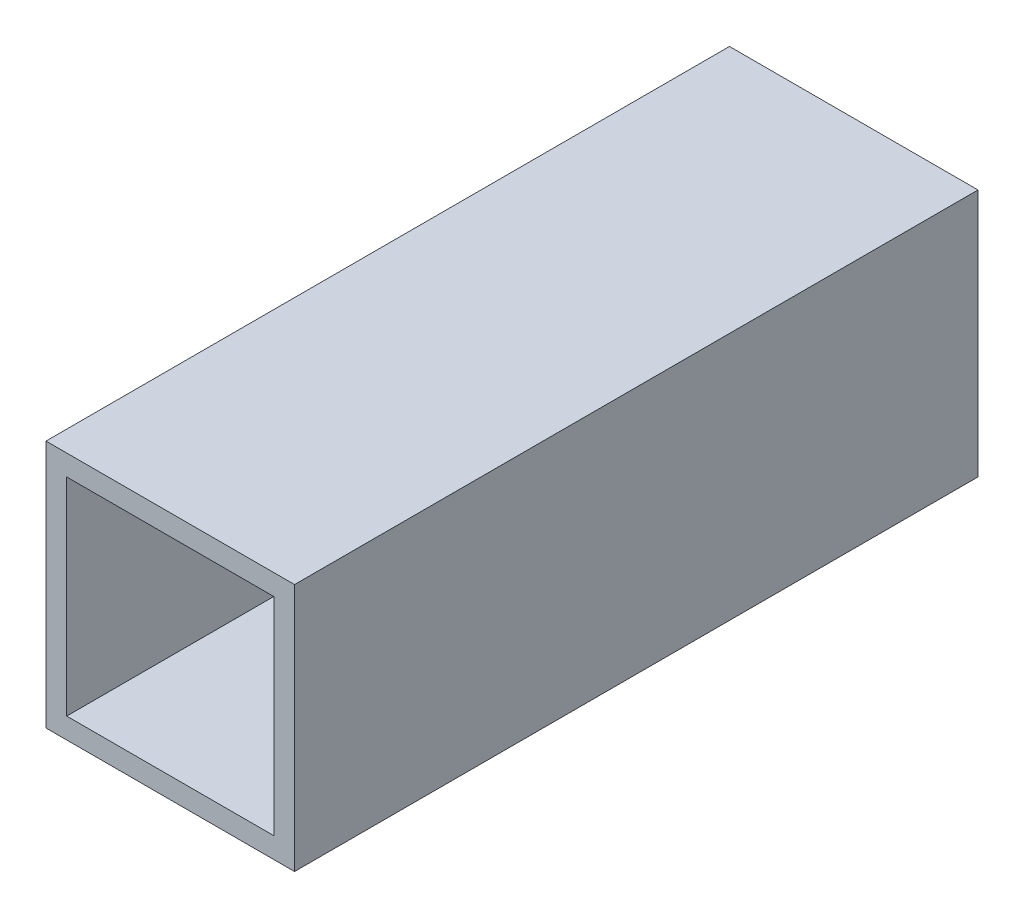
ISO-10303-21;
HEADER;
FILE_DESCRIPTION(('STEP AP214'),'2;1');
FILE_NAME('part.step','',(''),(''),'','','');
FILE_SCHEMA(('AUTOMOTIVE_DESIGN { 1 0 10303 214 1 1 1 1 }'));
ENDSEC;
DATA;
#1=APPLICATION_CONTEXT('core data for automotive mechanical design processes');
#2=APPLICATION_PROTOCOL_DEFINITION('international standard','automotive_design',2000,#1);
#3=PRODUCT_CONTEXT('',#1,'mechanical');
#4=PRODUCT('Part','Part','',(#3));
#5=PRODUCT_RELATED_PRODUCT_CATEGORY('part','',(#4));
#6=PRODUCT_DEFINITION_FORMATION('','',#4);
#7=PRODUCT_DEFINITION_CONTEXT('part definition',#1,'design');
#8=PRODUCT_DEFINITION('design','',#6,#7);
#9=PRODUCT_DEFINITION_SHAPE('','',#8);
#10=(LENGTH_UNIT() NAMED_UNIT(*) SI_UNIT(.MILLI.,.METRE.));
#11=(NAMED_UNIT(*) PLANE_ANGLE_UNIT() SI_UNIT($,.RADIAN.));
#12=(NAMED_UNIT(*) SI_UNIT($,.STERADIAN.) SOLID_ANGLE_UNIT());
#13=UNCERTAINTY_MEASURE_WITH_UNIT(LENGTH_MEASURE(1.E-05),#10,'distance_accuracy_value','');
#14=(GEOMETRIC_REPRESENTATION_CONTEXT(3) GLOBAL_UNCERTAINTY_ASSIGNED_CONTEXT((#13)) GLOBAL_UNIT_ASSIGNED_CONTEXT((#10,
#11,#12)) REPRESENTATION_CONTEXT('',''));
#15=CARTESIAN_POINT('',(0.,0.,0.));
#16=DIRECTION('',(0.,0.,1.));
#17=DIRECTION('',(1.,0.,0.));
#18=AXIS2_PLACEMENT_3D('',#15,#16,#17);
#19=CARTESIAN_POINT('',(0.,0.,33.));
#20=DIRECTION('',(0.,0.,1.));
#21=DIRECTION('',(1.,0.,0.));
#22=AXIS2_PLACEMENT_3D('',#19,#20,#21);
#23=PLANE('',#22);
#24=DIRECTION('',(0.,-1.,0.));
#25=VECTOR('',#24,1.);
#26=CARTESIAN_POINT('',(-12.,12.,33.));
#27=LINE('',#26,#25);
#28=CARTESIAN_POINT('',(-12.,12.,33.));
#29=VERTEX_POINT('',#28);
#30=CARTESIAN_POINT('',(-12.,-12.,33.));
#31=VERTEX_POINT('',#30);
#32=EDGE_CURVE('E138',#29,#31,#27,.T.);
#33=ORIENTED_EDGE('',*,*,#32,.T.);
#34=DIRECTION('',(1.,0.,0.));
#35=VECTOR('',#34,1.);
#36=CARTESIAN_POINT('',(-12.,-12.,33.));
#37=LINE('',#36,#35);
#38=CARTESIAN_POINT('',(12.,-12.,33.));
#39=VERTEX_POINT('',#38);
#40=EDGE_CURVE('E141',#31,#39,#37,.T.);
#41=ORIENTED_EDGE('',*,*,#40,.T.);
#42=DIRECTION('',(0.,1.,0.));
#43=VECTOR('',#42,1.);
#44=CARTESIAN_POINT('',(12.,12.,33.));
#45=LINE('',#44,#43);
#46=CARTESIAN_POINT('',(12.,12.,33.));
#47=VERTEX_POINT('',#46);
#48=EDGE_CURVE('E144',#39,#47,#45,.T.);
#49=ORIENTED_EDGE('',*,*,#48,.T.);
#50=DIRECTION('',(-1.,0.,0.));
#51=VECTOR('',#50,1.);
#52=CARTESIAN_POINT('',(-12.,12.,33.));
#53=LINE('',#52,#51);
#54=EDGE_CURVE('E146',#47,#29,#53,.T.);
#55=ORIENTED_EDGE('',*,*,#54,.T.);
#56=EDGE_LOOP('',(#33,#41,#49,#55));
#57=FACE_BOUND('',#56,.T.);
#58=DIRECTION('',(-1.,0.,0.));
#59=VECTOR('',#58,1.);
#60=CARTESIAN_POINT('',(-10.,10.,33.));
#61=LINE('',#60,#59);
#62=CARTESIAN_POINT('',(10.,10.,33.));
#63=VERTEX_POINT('',#62);
#64=CARTESIAN_POINT('',(-10.,10.,33.));
#65=VERTEX_POINT('',#64);
#66=EDGE_CURVE('E110',#63,#65,#61,.T.);
#67=ORIENTED_EDGE('',*,*,#66,.F.);
#68=DIRECTION('',(0.,1.,0.));
#69=VECTOR('',#68,1.);
#70=CARTESIAN_POINT('',(10.,10.,33.));
#71=LINE('',#70,#69);
#72=CARTESIAN_POINT('',(10.,-10.,33.));
#73=VERTEX_POINT('',#72);
#74=EDGE_CURVE('E102',#73,#63,#71,.T.);
#75=ORIENTED_EDGE('',*,*,#74,.F.);
#76=DIRECTION('',(1.,0.,0.));
#77=VECTOR('',#76,1.);
#78=CARTESIAN_POINT('',(-10.,-10.,33.));
#79=LINE('',#78,#77);
#80=CARTESIAN_POINT('',(-10.,-10.,33.));
#81=VERTEX_POINT('',#80);
#82=EDGE_CURVE('E124',#81,#73,#79,.T.);
#83=ORIENTED_EDGE('',*,*,#82,.F.);
#84=DIRECTION('',(0.,-1.,0.));
#85=VECTOR('',#84,1.);
#86=CARTESIAN_POINT('',(-10.,10.,33.));
#87=LINE('',#86,#85);
#88=EDGE_CURVE('E122',#65,#81,#87,.T.);
#89=ORIENTED_EDGE('',*,*,#88,.F.);
#90=EDGE_LOOP('',(#67,#75,#83,#89));
#91=FACE_BOUND('',#90,.T.);
#92=ADVANCED_FACE('F37',(#57,#91),#23,.T.);
#93=CARTESIAN_POINT('',(0.,0.,-33.));
#94=DIRECTION('',(0.,0.,1.));
#95=DIRECTION('',(1.,0.,0.));
#96=AXIS2_PLACEMENT_3D('',#93,#94,#95);
#97=PLANE('',#96);
#98=DIRECTION('',(0.,-1.,0.));
#99=VECTOR('',#98,1.);
#100=CARTESIAN_POINT('',(-12.,12.,-33.));
#101=LINE('',#100,#99);
#102=CARTESIAN_POINT('',(-12.,12.,-33.));
#103=VERTEX_POINT('',#102);
#104=CARTESIAN_POINT('',(-12.,-12.,-33.));
#105=VERTEX_POINT('',#104);
#106=EDGE_CURVE('E118',#103,#105,#101,.T.);
#107=ORIENTED_EDGE('',*,*,#106,.F.);
#108=DIRECTION('',(-1.,0.,0.));
#109=VECTOR('',#108,1.);
#110=CARTESIAN_POINT('',(-12.,12.,-33.));
#111=LINE('',#110,#109);
#112=CARTESIAN_POINT('',(12.,12.,-33.));
#113=VERTEX_POINT('',#112);
#114=EDGE_CURVE('E142',#113,#103,#111,.T.);
#115=ORIENTED_EDGE('',*,*,#114,.F.);
#116=DIRECTION('',(0.,1.,0.));
#117=VECTOR('',#116,1.);
#118=CARTESIAN_POINT('',(12.,12.,-33.));
#119=LINE('',#118,#117);
#120=CARTESIAN_POINT('',(12.,-12.,-33.));
#121=VERTEX_POINT('',#120);
#122=EDGE_CURVE('E153',#121,#113,#119,.T.);
#123=ORIENTED_EDGE('',*,*,#122,.F.);
#124=DIRECTION('',(1.,0.,0.));
#125=VECTOR('',#124,1.);
#126=CARTESIAN_POINT('',(-12.,-12.,-33.));
#127=LINE('',#126,#125);
#128=EDGE_CURVE('E151',#105,#121,#127,.T.);
#129=ORIENTED_EDGE('',*,*,#128,.F.);
#130=EDGE_LOOP('',(#107,#115,#123,#129));
#131=FACE_BOUND('',#130,.T.);
#132=DIRECTION('',(0.,1.,0.));
#133=VECTOR('',#132,1.);
#134=CARTESIAN_POINT('',(10.,10.,-33.));
#135=LINE('',#134,#133);
#136=CARTESIAN_POINT('',(10.,-10.,-33.));
#137=VERTEX_POINT('',#136);
#138=CARTESIAN_POINT('',(10.,10.,-33.));
#139=VERTEX_POINT('',#138);
#140=EDGE_CURVE('E60',#137,#139,#135,.T.);
#141=ORIENTED_EDGE('',*,*,#140,.T.);
#142=DIRECTION('',(-1.,0.,0.));
#143=VECTOR('',#142,1.);
#144=CARTESIAN_POINT('',(-10.,10.,-33.));
#145=LINE('',#144,#143);
#146=CARTESIAN_POINT('',(-10.,10.,-33.));
#147=VERTEX_POINT('',#146);
#148=EDGE_CURVE('E117',#139,#147,#145,.T.);
#149=ORIENTED_EDGE('',*,*,#148,.T.);
#150=DIRECTION('',(0.,-1.,0.));
#151=VECTOR('',#150,1.);
#152=CARTESIAN_POINT('',(-10.,10.,-33.));
#153=LINE('',#152,#151);
#154=CARTESIAN_POINT('',(-10.,-10.,-33.));
#155=VERTEX_POINT('',#154);
#156=EDGE_CURVE('E130',#147,#155,#153,.T.);
#157=ORIENTED_EDGE('',*,*,#156,.T.);
#158=DIRECTION('',(1.,0.,0.));
#159=VECTOR('',#158,1.);
#160=CARTESIAN_POINT('',(-10.,-10.,-33.));
#161=LINE('',#160,#159);
#162=EDGE_CURVE('E111',#155,#137,#161,.T.);
#163=ORIENTED_EDGE('',*,*,#162,.T.);
#164=EDGE_LOOP('',(#141,#149,#157,#163));
#165=FACE_BOUND('',#164,.T.);
#166=ADVANCED_FACE('F171',(#131,#165),#97,.F.);
#167=CARTESIAN_POINT('',(-12.,12.,33.));
#168=DIRECTION('',(1.,0.,0.));
#169=DIRECTION('',(0.,1.,0.));
#170=AXIS2_PLACEMENT_3D('',#167,#168,#169);
#171=PLANE('',#170);
#172=ORIENTED_EDGE('',*,*,#106,.T.);
#173=DIRECTION('',(0.,0.,-1.));
#174=VECTOR('',#173,1.);
#175=CARTESIAN_POINT('',(-12.,-12.,33.));
#176=LINE('',#175,#174);
#177=EDGE_CURVE('E11',#31,#105,#176,.T.);
#178=ORIENTED_EDGE('',*,*,#177,.F.);
#179=ORIENTED_EDGE('',*,*,#32,.F.);
#180=DIRECTION('',(0.,0.,-1.));
#181=VECTOR('',#180,1.);
#182=CARTESIAN_POINT('',(-12.,12.,33.));
#183=LINE('',#182,#181);
#184=EDGE_CURVE('E148',#29,#103,#183,.T.);
#185=ORIENTED_EDGE('',*,*,#184,.T.);
#186=EDGE_LOOP('',(#172,#178,#179,#185));
#187=FACE_BOUND('',#186,.T.);
#188=ADVANCED_FACE('F39',(#187),#171,.F.);
#189=CARTESIAN_POINT('',(-12.,-12.,33.));
#190=DIRECTION('',(0.,1.,0.));
#191=DIRECTION('',(-1.,0.,0.));
#192=AXIS2_PLACEMENT_3D('',#189,#190,#191);
#193=PLANE('',#192);
#194=ORIENTED_EDGE('',*,*,#128,.T.);
#195=DIRECTION('',(0.,0.,-1.));
#196=VECTOR('',#195,1.);
#197=CARTESIAN_POINT('',(12.,-12.,33.));
#198=LINE('',#197,#196);
#199=EDGE_CURVE('E45',#39,#121,#198,.T.);
#200=ORIENTED_EDGE('',*,*,#199,.F.);
#201=ORIENTED_EDGE('',*,*,#40,.F.);
#202=ORIENTED_EDGE('',*,*,#177,.T.);
#203=EDGE_LOOP('',(#194,#200,#201,#202));
#204=FACE_BOUND('',#203,.T.);
#205=ADVANCED_FACE('F181',(#204),#193,.F.);
#206=CARTESIAN_POINT('',(12.,12.,33.));
#207=DIRECTION('',(-1.,0.,0.));
#208=DIRECTION('',(0.,-1.,0.));
#209=AXIS2_PLACEMENT_3D('',#206,#207,#208);
#210=PLANE('',#209);
#211=ORIENTED_EDGE('',*,*,#122,.T.);
#212=DIRECTION('',(0.,0.,-1.));
#213=VECTOR('',#212,1.);
#214=CARTESIAN_POINT('',(12.,12.,33.));
#215=LINE('',#214,#213);
#216=EDGE_CURVE('E158',#47,#113,#215,.T.);
#217=ORIENTED_EDGE('',*,*,#216,.F.);
#218=ORIENTED_EDGE('',*,*,#48,.F.);
#219=ORIENTED_EDGE('',*,*,#199,.T.);
#220=EDGE_LOOP('',(#211,#217,#218,#219));
#221=FACE_BOUND('',#220,.T.);
#222=ADVANCED_FACE('F165',(#221),#210,.F.);
#223=CARTESIAN_POINT('',(-12.,12.,33.));
#224=DIRECTION('',(0.,-1.,0.));
#225=DIRECTION('',(0.,0.,-1.));
#226=AXIS2_PLACEMENT_3D('',#223,#224,#225);
#227=PLANE('',#226);
#228=ORIENTED_EDGE('',*,*,#114,.T.);
#229=ORIENTED_EDGE('',*,*,#184,.F.);
#230=ORIENTED_EDGE('',*,*,#54,.F.);
#231=ORIENTED_EDGE('',*,*,#216,.T.);
#232=EDGE_LOOP('',(#228,#229,#230,#231));
#233=FACE_BOUND('',#232,.T.);
#234=ADVANCED_FACE('F175',(#233),#227,.F.);
#235=CARTESIAN_POINT('',(10.,10.,33.));
#236=DIRECTION('',(-1.,0.,0.));
#237=DIRECTION('',(0.,0.,1.));
#238=AXIS2_PLACEMENT_3D('',#235,#236,#237);
#239=PLANE('',#238);
#240=ORIENTED_EDGE('',*,*,#140,.F.);
#241=DIRECTION('',(0.,0.,-1.));
#242=VECTOR('',#241,1.);
#243=CARTESIAN_POINT('',(10.,-10.,33.));
#244=LINE('',#243,#242);
#245=EDGE_CURVE('E106',#73,#137,#244,.T.);
#246=ORIENTED_EDGE('',*,*,#245,.F.);
#247=ORIENTED_EDGE('',*,*,#74,.T.);
#248=DIRECTION('',(0.,0.,-1.));
#249=VECTOR('',#248,1.);
#250=CARTESIAN_POINT('',(10.,10.,33.));
#251=LINE('',#250,#249);
#252=EDGE_CURVE('E105',#63,#139,#251,.T.);
#253=ORIENTED_EDGE('',*,*,#252,.T.);
#254=EDGE_LOOP('',(#240,#246,#247,#253));
#255=FACE_BOUND('',#254,.T.);
#256=ADVANCED_FACE('F104',(#255),#239,.T.);
#257=CARTESIAN_POINT('',(-10.,10.,33.));
#258=DIRECTION('',(0.,-1.,0.));
#259=DIRECTION('',(0.,0.,-1.));
#260=AXIS2_PLACEMENT_3D('',#257,#258,#259);
#261=PLANE('',#260);
#262=ORIENTED_EDGE('',*,*,#148,.F.);
#263=ORIENTED_EDGE('',*,*,#252,.F.);
#264=ORIENTED_EDGE('',*,*,#66,.T.);
#265=DIRECTION('',(0.,0.,-1.));
#266=VECTOR('',#265,1.);
#267=CARTESIAN_POINT('',(-10.,10.,33.));
#268=LINE('',#267,#266);
#269=EDGE_CURVE('E119',#65,#147,#268,.T.);
#270=ORIENTED_EDGE('',*,*,#269,.T.);
#271=EDGE_LOOP('',(#262,#263,#264,#270));
#272=FACE_BOUND('',#271,.T.);
#273=ADVANCED_FACE('F114',(#272),#261,.T.);
#274=CARTESIAN_POINT('',(-10.,10.,33.));
#275=DIRECTION('',(1.,0.,0.));
#276=DIRECTION('',(0.,1.,0.));
#277=AXIS2_PLACEMENT_3D('',#274,#275,#276);
#278=PLANE('',#277);
#279=ORIENTED_EDGE('',*,*,#156,.F.);
#280=ORIENTED_EDGE('',*,*,#269,.F.);
#281=ORIENTED_EDGE('',*,*,#88,.T.);
#282=DIRECTION('',(0.,0.,-1.));
#283=VECTOR('',#282,1.);
#284=CARTESIAN_POINT('',(-10.,-10.,33.));
#285=LINE('',#284,#283);
#286=EDGE_CURVE('E52',#81,#155,#285,.T.);
#287=ORIENTED_EDGE('',*,*,#286,.T.);
#288=EDGE_LOOP('',(#279,#280,#281,#287));
#289=FACE_BOUND('',#288,.T.);
#290=ADVANCED_FACE('F204',(#289),#278,.T.);
#291=CARTESIAN_POINT('',(-10.,-10.,33.));
#292=DIRECTION('',(0.,1.,0.));
#293=DIRECTION('',(0.,0.,1.));
#294=AXIS2_PLACEMENT_3D('',#291,#292,#293);
#295=PLANE('',#294);
#296=ORIENTED_EDGE('',*,*,#162,.F.);
#297=ORIENTED_EDGE('',*,*,#286,.F.);
#298=ORIENTED_EDGE('',*,*,#82,.T.);
#299=ORIENTED_EDGE('',*,*,#245,.T.);
#300=EDGE_LOOP('',(#296,#297,#298,#299));
#301=FACE_BOUND('',#300,.T.);
#302=ADVANCED_FACE('F208',(#301),#295,.T.);
#303=CLOSED_SHELL('',(#92,#166,#188,#205,#222,#234,#256,#273,#290,#302));
#304=MANIFOLD_SOLID_BREP('B2',#303);
#305=ADVANCED_BREP_SHAPE_REPRESENTATION('',(#18,#304),#14);
#306=SHAPE_DEFINITION_REPRESENTATION(#9,#305);
ENDSEC;
END-ISO-10303-21;
